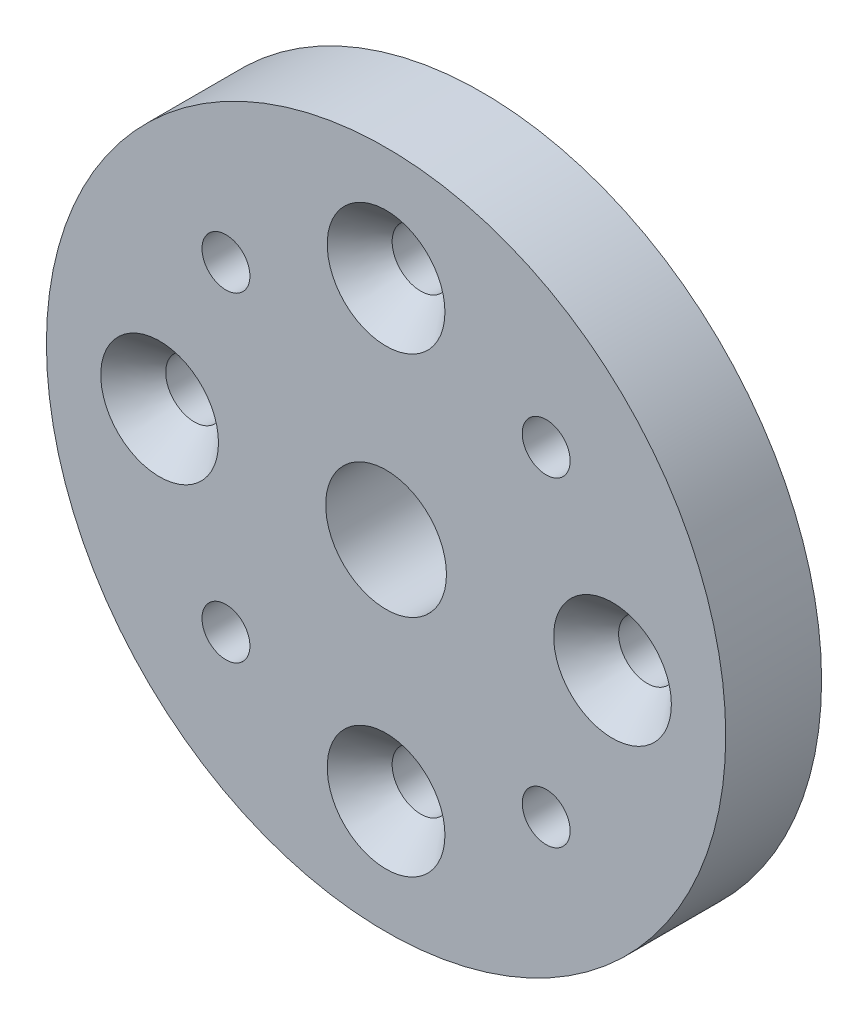
ISO-10303-21;
HEADER;
FILE_DESCRIPTION(('STEP AP214'),'2;1');
FILE_NAME('part.step','',(''),(''),'','','');
FILE_SCHEMA(('AUTOMOTIVE_DESIGN { 1 0 10303 214 1 1 1 1 }'));
ENDSEC;
DATA;
#1=APPLICATION_CONTEXT('core data for automotive mechanical design processes');
#2=APPLICATION_PROTOCOL_DEFINITION('international standard','automotive_design',2000,#1);
#3=PRODUCT_CONTEXT('',#1,'mechanical');
#4=PRODUCT('Part','Part','',(#3));
#5=PRODUCT_RELATED_PRODUCT_CATEGORY('part','',(#4));
#6=PRODUCT_DEFINITION_FORMATION('','',#4);
#7=PRODUCT_DEFINITION_CONTEXT('part definition',#1,'design');
#8=PRODUCT_DEFINITION('design','',#6,#7);
#9=PRODUCT_DEFINITION_SHAPE('','',#8);
#10=(LENGTH_UNIT() NAMED_UNIT(*) SI_UNIT(.MILLI.,.METRE.));
#11=(NAMED_UNIT(*) PLANE_ANGLE_UNIT() SI_UNIT($,.RADIAN.));
#12=(NAMED_UNIT(*) SI_UNIT($,.STERADIAN.) SOLID_ANGLE_UNIT());
#13=UNCERTAINTY_MEASURE_WITH_UNIT(LENGTH_MEASURE(1.E-05),#10,'distance_accuracy_value','');
#14=(GEOMETRIC_REPRESENTATION_CONTEXT(3) GLOBAL_UNCERTAINTY_ASSIGNED_CONTEXT((#13)) GLOBAL_UNIT_ASSIGNED_CONTEXT((#10,
#11,#12)) REPRESENTATION_CONTEXT('',''));
#15=CARTESIAN_POINT('',(0.,0.,0.));
#16=DIRECTION('',(0.,0.,1.));
#17=DIRECTION('',(1.,0.,0.));
#18=AXIS2_PLACEMENT_3D('',#15,#16,#17);
#19=CARTESIAN_POINT('',(0.,0.,6.35));
#20=DIRECTION('',(0.,0.,1.));
#21=DIRECTION('',(1.,0.,0.));
#22=AXIS2_PLACEMENT_3D('',#19,#20,#21);
#23=PLANE('',#22);
#24=CARTESIAN_POINT('',(3.48781665394082E-13,-15.0000000000002,6.35));
#25=DIRECTION('',(0.,0.,1.));
#26=DIRECTION('',(1.,0.,0.));
#27=AXIS2_PLACEMENT_3D('',#24,#25,#26);
#28=CIRCLE('',#27,3.8989000000297);
#29=CARTESIAN_POINT('',(3.89890000003005,-15.0000000000002,6.35));
#30=VERTEX_POINT('',#29);
#31=EDGE_CURVE('E46',#30,#30,#28,.F.);
#32=ORIENTED_EDGE('',*,*,#31,.T.);
#33=EDGE_LOOP('',(#32));
#34=FACE_BOUND('',#33,.T.);
#35=CARTESIAN_POINT('',(-15.,1.57116660247941E-13,6.35));
#36=DIRECTION('',(0.,0.,1.));
#37=DIRECTION('',(1.,0.,0.));
#38=AXIS2_PLACEMENT_3D('',#35,#36,#37);
#39=CIRCLE('',#38,3.8989000000297);
#40=CARTESIAN_POINT('',(-11.1010999999703,1.57116660247941E-13,6.35));
#41=VERTEX_POINT('',#40);
#42=EDGE_CURVE('E51',#41,#41,#39,.F.);
#43=ORIENTED_EDGE('',*,*,#42,.T.);
#44=EDGE_LOOP('',(#43));
#45=FACE_BOUND('',#44,.T.);
#46=CARTESIAN_POINT('',(0.,15.,6.35));
#47=DIRECTION('',(0.,0.,1.));
#48=DIRECTION('',(1.,0.,0.));
#49=AXIS2_PLACEMENT_3D('',#46,#47,#48);
#50=CIRCLE('',#49,3.8989000000297);
#51=CARTESIAN_POINT('',(3.8989000000297,15.,6.35));
#52=VERTEX_POINT('',#51);
#53=EDGE_CURVE('E54',#52,#52,#50,.F.);
#54=ORIENTED_EDGE('',*,*,#53,.T.);
#55=EDGE_LOOP('',(#54));
#56=FACE_BOUND('',#55,.T.);
#57=CARTESIAN_POINT('',(15.,0.,6.35));
#58=DIRECTION('',(0.,0.,1.));
#59=DIRECTION('',(1.,0.,0.));
#60=AXIS2_PLACEMENT_3D('',#57,#58,#59);
#61=CIRCLE('',#60,3.89890000002971);
#62=CARTESIAN_POINT('',(18.8989000000297,0.,6.35));
#63=VERTEX_POINT('',#62);
#64=EDGE_CURVE('E57',#63,#63,#61,.F.);
#65=ORIENTED_EDGE('',*,*,#64,.T.);
#66=EDGE_LOOP('',(#65));
#67=FACE_BOUND('',#66,.T.);
#68=CARTESIAN_POINT('',(0.,0.,6.35));
#69=DIRECTION('',(0.,0.,1.));
#70=DIRECTION('',(1.,0.,0.));
#71=AXIS2_PLACEMENT_3D('',#68,#69,#70);
#72=CIRCLE('',#71,22.5);
#73=CARTESIAN_POINT('',(22.5,0.,6.35));
#74=VERTEX_POINT('',#73);
#75=EDGE_CURVE('E63',#74,#74,#72,.T.);
#76=ORIENTED_EDGE('',*,*,#75,.T.);
#77=EDGE_LOOP('',(#76));
#78=FACE_BOUND('',#77,.T.);
#79=CARTESIAN_POINT('',(0.,0.,6.35));
#80=DIRECTION('',(0.,0.,1.));
#81=DIRECTION('',(1.,0.,0.));
#82=AXIS2_PLACEMENT_3D('',#79,#80,#81);
#83=CIRCLE('',#82,4.);
#84=CARTESIAN_POINT('',(4.,0.,6.35));
#85=VERTEX_POINT('',#84);
#86=EDGE_CURVE('E67',#85,#85,#83,.T.);
#87=ORIENTED_EDGE('',*,*,#86,.F.);
#88=EDGE_LOOP('',(#87));
#89=FACE_BOUND('',#88,.T.);
#90=CARTESIAN_POINT('',(10.6066017177982,10.6066017177982,6.35));
#91=DIRECTION('',(0.,0.,1.));
#92=DIRECTION('',(1.,0.,0.));
#93=AXIS2_PLACEMENT_3D('',#90,#91,#92);
#94=CIRCLE('',#93,1.5875);
#95=CARTESIAN_POINT('',(12.1941017177982,10.6066017177982,6.35));
#96=VERTEX_POINT('',#95);
#97=EDGE_CURVE('E78',#96,#96,#94,.T.);
#98=ORIENTED_EDGE('',*,*,#97,.F.);
#99=EDGE_LOOP('',(#98));
#100=FACE_BOUND('',#99,.T.);
#101=CARTESIAN_POINT('',(10.6066017177982,-10.6066017177983,6.35));
#102=DIRECTION('',(0.,0.,1.));
#103=DIRECTION('',(1.,0.,0.));
#104=AXIS2_PLACEMENT_3D('',#101,#102,#103);
#105=CIRCLE('',#104,1.5875);
#106=CARTESIAN_POINT('',(12.1941017177982,-10.6066017177983,6.35));
#107=VERTEX_POINT('',#106);
#108=EDGE_CURVE('E87',#107,#107,#105,.T.);
#109=ORIENTED_EDGE('',*,*,#108,.F.);
#110=EDGE_LOOP('',(#109));
#111=FACE_BOUND('',#110,.T.);
#112=CARTESIAN_POINT('',(-10.6066017177979,-10.6066017177983,6.35));
#113=DIRECTION('',(0.,0.,1.));
#114=DIRECTION('',(1.,0.,0.));
#115=AXIS2_PLACEMENT_3D('',#112,#113,#114);
#116=CIRCLE('',#115,1.5875);
#117=CARTESIAN_POINT('',(-9.01910171779788,-10.6066017177983,6.35));
#118=VERTEX_POINT('',#117);
#119=EDGE_CURVE('E96',#118,#118,#116,.T.);
#120=ORIENTED_EDGE('',*,*,#119,.F.);
#121=EDGE_LOOP('',(#120));
#122=FACE_BOUND('',#121,.T.);
#123=CARTESIAN_POINT('',(-10.6066017177981,10.6066017177983,6.35));
#124=DIRECTION('',(0.,0.,1.));
#125=DIRECTION('',(1.,0.,0.));
#126=AXIS2_PLACEMENT_3D('',#123,#124,#125);
#127=CIRCLE('',#126,1.5875);
#128=CARTESIAN_POINT('',(-9.01910171779808,10.6066017177983,6.35));
#129=VERTEX_POINT('',#128);
#130=EDGE_CURVE('E105',#129,#129,#127,.T.);
#131=ORIENTED_EDGE('',*,*,#130,.F.);
#132=EDGE_LOOP('',(#131));
#133=FACE_BOUND('',#132,.T.);
#134=ADVANCED_FACE('F31',(#34,#45,#56,#67,#78,#89,#100,#111,#122,#133),#23,.T.);
#135=CARTESIAN_POINT('',(0.,0.,0.));
#136=DIRECTION('',(0.,0.,1.));
#137=DIRECTION('',(1.,0.,0.));
#138=AXIS2_PLACEMENT_3D('',#135,#136,#137);
#139=PLANE('',#138);
#140=CARTESIAN_POINT('',(0.,0.,0.));
#141=DIRECTION('',(0.,0.,1.));
#142=DIRECTION('',(1.,0.,0.));
#143=AXIS2_PLACEMENT_3D('',#140,#141,#142);
#144=CIRCLE('',#143,22.5);
#145=CARTESIAN_POINT('',(22.5,0.,0.));
#146=VERTEX_POINT('',#145);
#147=EDGE_CURVE('E64',#146,#146,#144,.T.);
#148=ORIENTED_EDGE('',*,*,#147,.F.);
#149=EDGE_LOOP('',(#148));
#150=FACE_BOUND('',#149,.T.);
#151=CARTESIAN_POINT('',(0.,0.,0.));
#152=DIRECTION('',(0.,0.,1.));
#153=DIRECTION('',(1.,0.,0.));
#154=AXIS2_PLACEMENT_3D('',#151,#152,#153);
#155=CIRCLE('',#154,4.);
#156=CARTESIAN_POINT('',(4.,0.,0.));
#157=VERTEX_POINT('',#156);
#158=EDGE_CURVE('E70',#157,#157,#155,.T.);
#159=ORIENTED_EDGE('',*,*,#158,.T.);
#160=EDGE_LOOP('',(#159));
#161=FACE_BOUND('',#160,.T.);
#162=CARTESIAN_POINT('',(0.,15.,0.));
#163=DIRECTION('',(0.,0.,1.));
#164=DIRECTION('',(1.,0.,0.));
#165=AXIS2_PLACEMENT_3D('',#162,#163,#164);
#166=CIRCLE('',#165,1.89865);
#167=CARTESIAN_POINT('',(1.89865,15.,0.));
#168=VERTEX_POINT('',#167);
#169=EDGE_CURVE('E73',#168,#168,#166,.T.);
#170=ORIENTED_EDGE('',*,*,#169,.T.);
#171=EDGE_LOOP('',(#170));
#172=FACE_BOUND('',#171,.T.);
#173=CARTESIAN_POINT('',(10.6066017177982,10.6066017177982,0.));
#174=DIRECTION('',(0.,0.,1.));
#175=DIRECTION('',(1.,0.,0.));
#176=AXIS2_PLACEMENT_3D('',#173,#174,#175);
#177=CIRCLE('',#176,1.5875);
#178=CARTESIAN_POINT('',(12.1941017177982,10.6066017177982,0.));
#179=VERTEX_POINT('',#178);
#180=EDGE_CURVE('E79',#179,#179,#177,.T.);
#181=ORIENTED_EDGE('',*,*,#180,.T.);
#182=EDGE_LOOP('',(#181));
#183=FACE_BOUND('',#182,.T.);
#184=CARTESIAN_POINT('',(15.,0.,0.));
#185=DIRECTION('',(0.,0.,1.));
#186=DIRECTION('',(1.,0.,0.));
#187=AXIS2_PLACEMENT_3D('',#184,#185,#186);
#188=CIRCLE('',#187,1.89865);
#189=CARTESIAN_POINT('',(16.89865,0.,0.));
#190=VERTEX_POINT('',#189);
#191=EDGE_CURVE('E82',#190,#190,#188,.T.);
#192=ORIENTED_EDGE('',*,*,#191,.T.);
#193=EDGE_LOOP('',(#192));
#194=FACE_BOUND('',#193,.T.);
#195=CARTESIAN_POINT('',(10.6066017177982,-10.6066017177983,0.));
#196=DIRECTION('',(0.,0.,1.));
#197=DIRECTION('',(1.,0.,0.));
#198=AXIS2_PLACEMENT_3D('',#195,#196,#197);
#199=CIRCLE('',#198,1.5875);
#200=CARTESIAN_POINT('',(12.1941017177982,-10.6066017177983,0.));
#201=VERTEX_POINT('',#200);
#202=EDGE_CURVE('E88',#201,#201,#199,.T.);
#203=ORIENTED_EDGE('',*,*,#202,.T.);
#204=EDGE_LOOP('',(#203));
#205=FACE_BOUND('',#204,.T.);
#206=CARTESIAN_POINT('',(3.48781665394082E-13,-15.0000000000002,0.));
#207=DIRECTION('',(0.,0.,1.));
#208=DIRECTION('',(1.,0.,0.));
#209=AXIS2_PLACEMENT_3D('',#206,#207,#208);
#210=CIRCLE('',#209,1.89865);
#211=CARTESIAN_POINT('',(1.89865000000035,-15.0000000000002,0.));
#212=VERTEX_POINT('',#211);
#213=EDGE_CURVE('E91',#212,#212,#210,.T.);
#214=ORIENTED_EDGE('',*,*,#213,.T.);
#215=EDGE_LOOP('',(#214));
#216=FACE_BOUND('',#215,.T.);
#217=CARTESIAN_POINT('',(-10.6066017177979,-10.6066017177983,0.));
#218=DIRECTION('',(0.,0.,1.));
#219=DIRECTION('',(1.,0.,0.));
#220=AXIS2_PLACEMENT_3D('',#217,#218,#219);
#221=CIRCLE('',#220,1.5875);
#222=CARTESIAN_POINT('',(-9.01910171779788,-10.6066017177983,0.));
#223=VERTEX_POINT('',#222);
#224=EDGE_CURVE('E97',#223,#223,#221,.T.);
#225=ORIENTED_EDGE('',*,*,#224,.T.);
#226=EDGE_LOOP('',(#225));
#227=FACE_BOUND('',#226,.T.);
#228=CARTESIAN_POINT('',(-15.,1.57116660247941E-13,0.));
#229=DIRECTION('',(0.,0.,1.));
#230=DIRECTION('',(1.,0.,0.));
#231=AXIS2_PLACEMENT_3D('',#228,#229,#230);
#232=CIRCLE('',#231,1.89865);
#233=CARTESIAN_POINT('',(-13.10135,1.57116660247941E-13,0.));
#234=VERTEX_POINT('',#233);
#235=EDGE_CURVE('E100',#234,#234,#232,.T.);
#236=ORIENTED_EDGE('',*,*,#235,.T.);
#237=EDGE_LOOP('',(#236));
#238=FACE_BOUND('',#237,.T.);
#239=CARTESIAN_POINT('',(-10.6066017177981,10.6066017177983,0.));
#240=DIRECTION('',(0.,0.,1.));
#241=DIRECTION('',(1.,0.,0.));
#242=AXIS2_PLACEMENT_3D('',#239,#240,#241);
#243=CIRCLE('',#242,1.5875);
#244=CARTESIAN_POINT('',(-9.01910171779808,10.6066017177983,0.));
#245=VERTEX_POINT('',#244);
#246=EDGE_CURVE('E106',#245,#245,#243,.T.);
#247=ORIENTED_EDGE('',*,*,#246,.T.);
#248=EDGE_LOOP('',(#247));
#249=FACE_BOUND('',#248,.T.);
#250=ADVANCED_FACE('F116',(#150,#161,#172,#183,#194,#205,#216,#227,#238,#249),#139,.F.);
#251=CARTESIAN_POINT('',(0.,0.,6.35));
#252=DIRECTION('',(0.,0.,-1.));
#253=DIRECTION('',(-1.,0.,0.));
#254=AXIS2_PLACEMENT_3D('',#251,#252,#253);
#255=CYLINDRICAL_SURFACE('',#254,22.5);
#256=ORIENTED_EDGE('',*,*,#75,.F.);
#257=EDGE_LOOP('',(#256));
#258=FACE_BOUND('',#257,.T.);
#259=ORIENTED_EDGE('',*,*,#147,.T.);
#260=EDGE_LOOP('',(#259));
#261=FACE_BOUND('',#260,.T.);
#262=ADVANCED_FACE('F122',(#258,#261),#255,.T.);
#263=CARTESIAN_POINT('',(0.,0.,6.35));
#264=DIRECTION('',(0.,0.,-1.));
#265=DIRECTION('',(-1.,0.,0.));
#266=AXIS2_PLACEMENT_3D('',#263,#264,#265);
#267=CYLINDRICAL_SURFACE('',#266,4.);
#268=ORIENTED_EDGE('',*,*,#86,.T.);
#269=EDGE_LOOP('',(#268));
#270=FACE_BOUND('',#269,.T.);
#271=ORIENTED_EDGE('',*,*,#158,.F.);
#272=EDGE_LOOP('',(#271));
#273=FACE_BOUND('',#272,.T.);
#274=ADVANCED_FACE('F127',(#270,#273),#267,.F.);
#275=CARTESIAN_POINT('',(0.,15.,6.35));
#276=DIRECTION('',(0.,0.,-1.));
#277=DIRECTION('',(-1.,0.,0.));
#278=AXIS2_PLACEMENT_3D('',#275,#276,#277);
#279=CYLINDRICAL_SURFACE('',#278,1.89865);
#280=CARTESIAN_POINT('',(0.,15.,4.048975593422));
#281=DIRECTION('',(0.,0.,1.));
#282=DIRECTION('',(1.,0.,0.));
#283=AXIS2_PLACEMENT_3D('',#280,#281,#282);
#284=CIRCLE('',#283,1.89865);
#285=CARTESIAN_POINT('',(1.89865,15.,4.048975593422));
#286=VERTEX_POINT('',#285);
#287=EDGE_CURVE('E38',#286,#286,#284,.T.);
#288=ORIENTED_EDGE('',*,*,#287,.T.);
#289=EDGE_LOOP('',(#288));
#290=FACE_BOUND('',#289,.T.);
#291=ORIENTED_EDGE('',*,*,#169,.F.);
#292=EDGE_LOOP('',(#291));
#293=FACE_BOUND('',#292,.T.);
#294=ADVANCED_FACE('F195',(#290,#293),#279,.F.);
#295=CARTESIAN_POINT('',(10.6066017177982,10.6066017177982,6.35));
#296=DIRECTION('',(0.,0.,-1.));
#297=DIRECTION('',(-1.,0.,0.));
#298=AXIS2_PLACEMENT_3D('',#295,#296,#297);
#299=CYLINDRICAL_SURFACE('',#298,1.5875);
#300=ORIENTED_EDGE('',*,*,#97,.T.);
#301=EDGE_LOOP('',(#300));
#302=FACE_BOUND('',#301,.T.);
#303=ORIENTED_EDGE('',*,*,#180,.F.);
#304=EDGE_LOOP('',(#303));
#305=FACE_BOUND('',#304,.T.);
#306=ADVANCED_FACE('F193',(#302,#305),#299,.F.);
#307=CARTESIAN_POINT('',(15.,0.,6.35));
#308=DIRECTION('',(0.,0.,-1.));
#309=DIRECTION('',(-1.,0.,0.));
#310=AXIS2_PLACEMENT_3D('',#307,#308,#309);
#311=CYLINDRICAL_SURFACE('',#310,1.89865);
#312=CARTESIAN_POINT('',(15.,0.,4.04897559342199));
#313=DIRECTION('',(0.,0.,1.));
#314=DIRECTION('',(1.,0.,0.));
#315=AXIS2_PLACEMENT_3D('',#312,#313,#314);
#316=CIRCLE('',#315,1.89865);
#317=CARTESIAN_POINT('',(16.89865,0.,4.04897559342199));
#318=VERTEX_POINT('',#317);
#319=EDGE_CURVE('E10',#318,#318,#316,.T.);
#320=ORIENTED_EDGE('',*,*,#319,.T.);
#321=EDGE_LOOP('',(#320));
#322=FACE_BOUND('',#321,.T.);
#323=ORIENTED_EDGE('',*,*,#191,.F.);
#324=EDGE_LOOP('',(#323));
#325=FACE_BOUND('',#324,.T.);
#326=ADVANCED_FACE('F189',(#322,#325),#311,.F.);
#327=CARTESIAN_POINT('',(10.6066017177982,-10.6066017177983,6.35));
#328=DIRECTION('',(0.,0.,-1.));
#329=DIRECTION('',(-1.,0.,0.));
#330=AXIS2_PLACEMENT_3D('',#327,#328,#329);
#331=CYLINDRICAL_SURFACE('',#330,1.5875);
#332=ORIENTED_EDGE('',*,*,#108,.T.);
#333=EDGE_LOOP('',(#332));
#334=FACE_BOUND('',#333,.T.);
#335=ORIENTED_EDGE('',*,*,#202,.F.);
#336=EDGE_LOOP('',(#335));
#337=FACE_BOUND('',#336,.T.);
#338=ADVANCED_FACE('F185',(#334,#337),#331,.F.);
#339=CARTESIAN_POINT('',(3.48781665394082E-13,-15.0000000000002,6.35));
#340=DIRECTION('',(0.,0.,-1.));
#341=DIRECTION('',(-1.,0.,0.));
#342=AXIS2_PLACEMENT_3D('',#339,#340,#341);
#343=CYLINDRICAL_SURFACE('',#342,1.89865);
#344=CARTESIAN_POINT('',(3.48781665394082E-13,-15.0000000000002,4.048975593422));
#345=DIRECTION('',(0.,0.,1.));
#346=DIRECTION('',(1.,0.,0.));
#347=AXIS2_PLACEMENT_3D('',#344,#345,#346);
#348=CIRCLE('',#347,1.89865);
#349=CARTESIAN_POINT('',(1.89865000000035,-15.0000000000002,4.048975593422));
#350=VERTEX_POINT('',#349);
#351=EDGE_CURVE('E60',#350,#350,#348,.T.);
#352=ORIENTED_EDGE('',*,*,#351,.T.);
#353=EDGE_LOOP('',(#352));
#354=FACE_BOUND('',#353,.T.);
#355=ORIENTED_EDGE('',*,*,#213,.F.);
#356=EDGE_LOOP('',(#355));
#357=FACE_BOUND('',#356,.T.);
#358=ADVANCED_FACE('F167',(#354,#357),#343,.F.);
#359=CARTESIAN_POINT('',(-10.6066017177979,-10.6066017177983,6.35));
#360=DIRECTION('',(0.,0.,-1.));
#361=DIRECTION('',(-1.,0.,0.));
#362=AXIS2_PLACEMENT_3D('',#359,#360,#361);
#363=CYLINDRICAL_SURFACE('',#362,1.5875);
#364=ORIENTED_EDGE('',*,*,#119,.T.);
#365=EDGE_LOOP('',(#364));
#366=FACE_BOUND('',#365,.T.);
#367=ORIENTED_EDGE('',*,*,#224,.F.);
#368=EDGE_LOOP('',(#367));
#369=FACE_BOUND('',#368,.T.);
#370=ADVANCED_FACE('F163',(#366,#369),#363,.F.);
#371=CARTESIAN_POINT('',(-15.,1.57116660247941E-13,6.35));
#372=DIRECTION('',(0.,0.,-1.));
#373=DIRECTION('',(-1.,0.,0.));
#374=AXIS2_PLACEMENT_3D('',#371,#372,#373);
#375=CYLINDRICAL_SURFACE('',#374,1.89865);
#376=CARTESIAN_POINT('',(-15.,1.57116660247941E-13,4.048975593422));
#377=DIRECTION('',(0.,0.,1.));
#378=DIRECTION('',(1.,0.,0.));
#379=AXIS2_PLACEMENT_3D('',#376,#377,#378);
#380=CIRCLE('',#379,1.89865);
#381=CARTESIAN_POINT('',(-13.10135,1.57116660247941E-13,4.048975593422));
#382=VERTEX_POINT('',#381);
#383=EDGE_CURVE('E42',#382,#382,#380,.T.);
#384=ORIENTED_EDGE('',*,*,#383,.T.);
#385=EDGE_LOOP('',(#384));
#386=FACE_BOUND('',#385,.T.);
#387=ORIENTED_EDGE('',*,*,#235,.F.);
#388=EDGE_LOOP('',(#387));
#389=FACE_BOUND('',#388,.T.);
#390=ADVANCED_FACE('F166',(#386,#389),#375,.F.);
#391=CARTESIAN_POINT('',(-10.6066017177981,10.6066017177983,6.35));
#392=DIRECTION('',(0.,0.,-1.));
#393=DIRECTION('',(-1.,0.,0.));
#394=AXIS2_PLACEMENT_3D('',#391,#392,#393);
#395=CYLINDRICAL_SURFACE('',#394,1.5875);
#396=ORIENTED_EDGE('',*,*,#130,.T.);
#397=EDGE_LOOP('',(#396));
#398=FACE_BOUND('',#397,.T.);
#399=ORIENTED_EDGE('',*,*,#246,.F.);
#400=EDGE_LOOP('',(#399));
#401=FACE_BOUND('',#400,.T.);
#402=ADVANCED_FACE('F112',(#398,#401),#395,.F.);
#403=CARTESIAN_POINT('',(3.48781665394082E-13,-15.0000000000002,4.048975593422));
#404=DIRECTION('',(0.,0.,1.));
#405=DIRECTION('',(1.,0.,0.));
#406=AXIS2_PLACEMENT_3D('',#403,#404,#405);
#407=CONICAL_SURFACE('',#406,1.89865,0.715584993317673);
#408=ORIENTED_EDGE('',*,*,#31,.F.);
#409=EDGE_LOOP('',(#408));
#410=FACE_BOUND('',#409,.T.);
#411=ORIENTED_EDGE('',*,*,#351,.F.);
#412=EDGE_LOOP('',(#411));
#413=FACE_BOUND('',#412,.T.);
#414=ADVANCED_FACE('F133',(#410,#413),#407,.F.);
#415=CARTESIAN_POINT('',(-15.,1.57116660247941E-13,4.048975593422));
#416=DIRECTION('',(0.,0.,1.));
#417=DIRECTION('',(1.,0.,0.));
#418=AXIS2_PLACEMENT_3D('',#415,#416,#417);
#419=CONICAL_SURFACE('',#418,1.89865,0.715584993317674);
#420=CARTESIAN_POINT('',(-11.1010999999703,1.57116660247941E-13,6.35));
#421=CARTESIAN_POINT('',(-11.1219359374706,1.57116660247941E-13,6.32603099576481));
#422=CARTESIAN_POINT('',(-11.1427718749709,1.57116660247941E-13,6.30206199152962));
#423=CARTESIAN_POINT('',(-11.1844437499715,1.57116660247941E-13,6.25412398305925));
#424=CARTESIAN_POINT('',(-11.2052796874718,1.57116660247941E-13,6.23015497882406));
#425=CARTESIAN_POINT('',(-11.2469515624725,1.57116660247941E-13,6.18221697035369));
#426=CARTESIAN_POINT('',(-11.2677874999728,1.57116660247941E-13,6.1582479661185));
#427=CARTESIAN_POINT('',(-11.3094593749734,1.57116660247941E-13,6.11030995764812));
#428=CARTESIAN_POINT('',(-11.3302953124737,1.57116660247941E-13,6.08634095341294));
#429=CARTESIAN_POINT('',(-11.3719671874743,1.57116660247941E-13,6.03840294494256));
#430=CARTESIAN_POINT('',(-11.3928031249746,1.57116660247941E-13,6.01443394070737));
#431=CARTESIAN_POINT('',(-11.4344749999752,1.57116660247941E-13,5.966495932237));
#432=CARTESIAN_POINT('',(-11.4553109374756,1.57116660247941E-13,5.94252692800181));
#433=CARTESIAN_POINT('',(-11.4969828124762,1.57116660247941E-13,5.89458891953144));
#434=CARTESIAN_POINT('',(-11.5178187499765,1.57116660247941E-13,5.87061991529625));
#435=CARTESIAN_POINT('',(-11.5594906249771,1.57116660247941E-13,5.82268190682587));
#436=CARTESIAN_POINT('',(-11.5803265624774,1.57116660247941E-13,5.79871290259069));
#437=CARTESIAN_POINT('',(-11.621998437478,1.57116660247941E-13,5.75077489412031));
#438=CARTESIAN_POINT('',(-11.6428343749783,1.57116660247941E-13,5.72680588988512));
#439=CARTESIAN_POINT('',(-11.684506249979,1.57116660247941E-13,5.67886788141475));
#440=CARTESIAN_POINT('',(-11.7053421874793,1.57116660247941E-13,5.65489887717956));
#441=CARTESIAN_POINT('',(-11.7470140624799,1.57116660247941E-13,5.60696086870919));
#442=CARTESIAN_POINT('',(-11.7678499999802,1.57116660247941E-13,5.582991864474));
#443=CARTESIAN_POINT('',(-11.8095218749808,1.57116660247941E-13,5.53505385600362));
#444=CARTESIAN_POINT('',(-11.8303578124811,1.57116660247941E-13,5.51108485176844));
#445=CARTESIAN_POINT('',(-11.8720296874817,1.57116660247941E-13,5.46314684329806));
#446=CARTESIAN_POINT('',(-11.8928656249821,1.57116660247941E-13,5.43917783906287));
#447=CARTESIAN_POINT('',(-11.9345374999827,1.57116660247941E-13,5.3912398305925));
#448=CARTESIAN_POINT('',(-11.955373437483,1.57116660247941E-13,5.36727082635731));
#449=CARTESIAN_POINT('',(-11.9970453124836,1.57116660247941E-13,5.31933281788694));
#450=CARTESIAN_POINT('',(-12.0178812499839,1.57116660247941E-13,5.29536381365175));
#451=CARTESIAN_POINT('',(-12.0595531249845,1.57116660247941E-13,5.24742580518137));
#452=CARTESIAN_POINT('',(-12.0803890624848,1.57116660247941E-13,5.22345680094619));
#453=CARTESIAN_POINT('',(-12.1220609374855,1.57116660247941E-13,5.17551879247581));
#454=CARTESIAN_POINT('',(-12.1428968749858,1.57116660247941E-13,5.15154978824062));
#455=CARTESIAN_POINT('',(-12.1845687499864,1.57116660247941E-13,5.10361177977025));
#456=CARTESIAN_POINT('',(-12.2054046874867,1.57116660247941E-13,5.07964277553506));
#457=CARTESIAN_POINT('',(-12.2470765624873,1.57116660247941E-13,5.03170476706469));
#458=CARTESIAN_POINT('',(-12.2679124999876,1.57116660247941E-13,5.0077357628295));
#459=CARTESIAN_POINT('',(-12.3095843749882,1.57116660247941E-13,4.95979775435912));
#460=CARTESIAN_POINT('',(-12.3304203124886,1.57116660247941E-13,4.93582875012394));
#461=CARTESIAN_POINT('',(-12.3720921874892,1.57116660247941E-13,4.88789074165356));
#462=CARTESIAN_POINT('',(-12.3929281249895,1.57116660247941E-13,4.86392173741837));
#463=CARTESIAN_POINT('',(-12.4345999999901,1.57116660247941E-13,4.815983728948));
#464=CARTESIAN_POINT('',(-12.4554359374904,1.57116660247941E-13,4.79201472471281));
#465=CARTESIAN_POINT('',(-12.497107812491,1.57116660247941E-13,4.74407671624244));
#466=CARTESIAN_POINT('',(-12.5179437499913,1.57116660247941E-13,4.72010771200725));
#467=CARTESIAN_POINT('',(-12.559615624992,1.57116660247941E-13,4.67216970353687));
#468=CARTESIAN_POINT('',(-12.5804515624923,1.57116660247941E-13,4.64820069930169));
#469=CARTESIAN_POINT('',(-12.6221234374929,1.57116660247941E-13,4.60026269083131));
#470=CARTESIAN_POINT('',(-12.6429593749932,1.57116660247941E-13,4.57629368659612));
#471=CARTESIAN_POINT('',(-12.6846312499938,1.57116660247941E-13,4.52835567812575));
#472=CARTESIAN_POINT('',(-12.7054671874941,1.57116660247941E-13,4.50438667389056));
#473=CARTESIAN_POINT('',(-12.7471390624947,1.57116660247941E-13,4.45644866542019));
#474=CARTESIAN_POINT('',(-12.767974999995,1.57116660247941E-13,4.432479661185));
#475=CARTESIAN_POINT('',(-12.8096468749957,1.57116660247941E-13,4.38454165271462));
#476=CARTESIAN_POINT('',(-12.830482812496,1.57116660247941E-13,4.36057264847944));
#477=CARTESIAN_POINT('',(-12.8721546874966,1.57116660247941E-13,4.31263464000906));
#478=CARTESIAN_POINT('',(-12.8929906249969,1.57116660247941E-13,4.28866563577387));
#479=CARTESIAN_POINT('',(-12.9346624999975,1.57116660247941E-13,4.2407276273035));
#480=CARTESIAN_POINT('',(-12.9554984374978,1.57116660247941E-13,4.21675862306831));
#481=CARTESIAN_POINT('',(-12.9971703124985,1.57116660247941E-13,4.16882061459794));
#482=CARTESIAN_POINT('',(-13.0180062499988,1.57116660247941E-13,4.14485161036275));
#483=CARTESIAN_POINT('',(-13.0596781249994,1.57116660247941E-13,4.09691360189237));
#484=CARTESIAN_POINT('',(-13.0805140624997,1.57116660247941E-13,4.07294459765719));
#485=CARTESIAN_POINT('',(-13.10135,1.57116660247941E-13,4.048975593422));
#486=B_SPLINE_CURVE_WITH_KNOTS('',3,(#420,#421,#422,#423,#424,#425,#426,#427,#428,#429,#430,
#431,#432,#433,#434,#435,#436,#437,#438,#439,#440,#441,#442,#443,#444,#445,#446,#447,#448,#449,
#450,#451,#452,#453,#454,#455,#456,#457,#458,#459,#460,#461,#462,#463,#464,#465,#466,#467,#468,
#469,#470,#471,#472,#473,#474,#475,#476,#477,#478,#479,#480,#481,#482,#483,#484,#485),
.UNSPECIFIED.,.F.,.F.,(4,2,2,2,2,2,2,2,2,2,2,2,2,2,2,2,2,2,2,2,2,2,2,2,2,2,2,2,2,2,2,2,4),(0.,
0.0952777261477686,0.190555452295536,0.285833178443305,0.381110904591074,0.476388630738841,
0.571666356886609,0.666944083034378,0.762221809182146,0.857499535329915,0.952777261477682,
1.04805498762545,1.14333271377322,1.23861043992099,1.33388816606876,1.42916589221652,
1.52444361836429,1.61972134451206,1.71499907065983,1.8102767968076,1.90555452295537,
2.00083224910313,2.0961099752509,2.19138770139867,2.28666542754644,2.38194315369421,
2.47722087984198,2.57249860598974,2.66777633213751,2.76305405828528,2.85833178443305,
2.95360951058082,3.04888723672859),.UNSPECIFIED.);
#487=EDGE_CURVE('BSEAM136',#41,#382,#486,.T.);
#488=ORIENTED_EDGE('',*,*,#42,.F.);
#489=ORIENTED_EDGE('',*,*,#383,.F.);
#490=ORIENTED_EDGE('',*,*,#487,.T.);
#491=ORIENTED_EDGE('',*,*,#487,.F.);
#492=EDGE_LOOP('',(#488,#490,#489,#491));
#493=FACE_BOUND('',#492,.T.);
#494=ADVANCED_FACE('F136',(#493),#419,.F.);
#495=CARTESIAN_POINT('',(0.,15.,4.048975593422));
#496=DIRECTION('',(0.,0.,1.));
#497=DIRECTION('',(1.,0.,0.));
#498=AXIS2_PLACEMENT_3D('',#495,#496,#497);
#499=CONICAL_SURFACE('',#498,1.89865,0.715584993317673);
#500=ORIENTED_EDGE('',*,*,#53,.F.);
#501=EDGE_LOOP('',(#500));
#502=FACE_BOUND('',#501,.T.);
#503=ORIENTED_EDGE('',*,*,#287,.F.);
#504=EDGE_LOOP('',(#503));
#505=FACE_BOUND('',#504,.T.);
#506=ADVANCED_FACE('F139',(#502,#505),#499,.F.);
#507=CARTESIAN_POINT('',(15.,0.,4.04897559342199));
#508=DIRECTION('',(0.,0.,1.));
#509=DIRECTION('',(1.,0.,0.));
#510=AXIS2_PLACEMENT_3D('',#507,#508,#509);
#511=CONICAL_SURFACE('',#510,1.89865,0.715584993317673);
#512=ORIENTED_EDGE('',*,*,#64,.F.);
#513=EDGE_LOOP('',(#512));
#514=FACE_BOUND('',#513,.T.);
#515=ORIENTED_EDGE('',*,*,#319,.F.);
#516=EDGE_LOOP('',(#515));
#517=FACE_BOUND('',#516,.T.);
#518=ADVANCED_FACE('F33',(#514,#517),#511,.F.);
#519=CLOSED_SHELL('',(#134,#250,#262,#274,#294,#306,#326,#338,#358,#370,#390,#402,#414,#494,
#506,#518));
#520=MANIFOLD_SOLID_BREP('B2',#519);
#521=ADVANCED_BREP_SHAPE_REPRESENTATION('',(#18,#520),#14);
#522=SHAPE_DEFINITION_REPRESENTATION(#9,#521);
ENDSEC;
END-ISO-10303-21;
